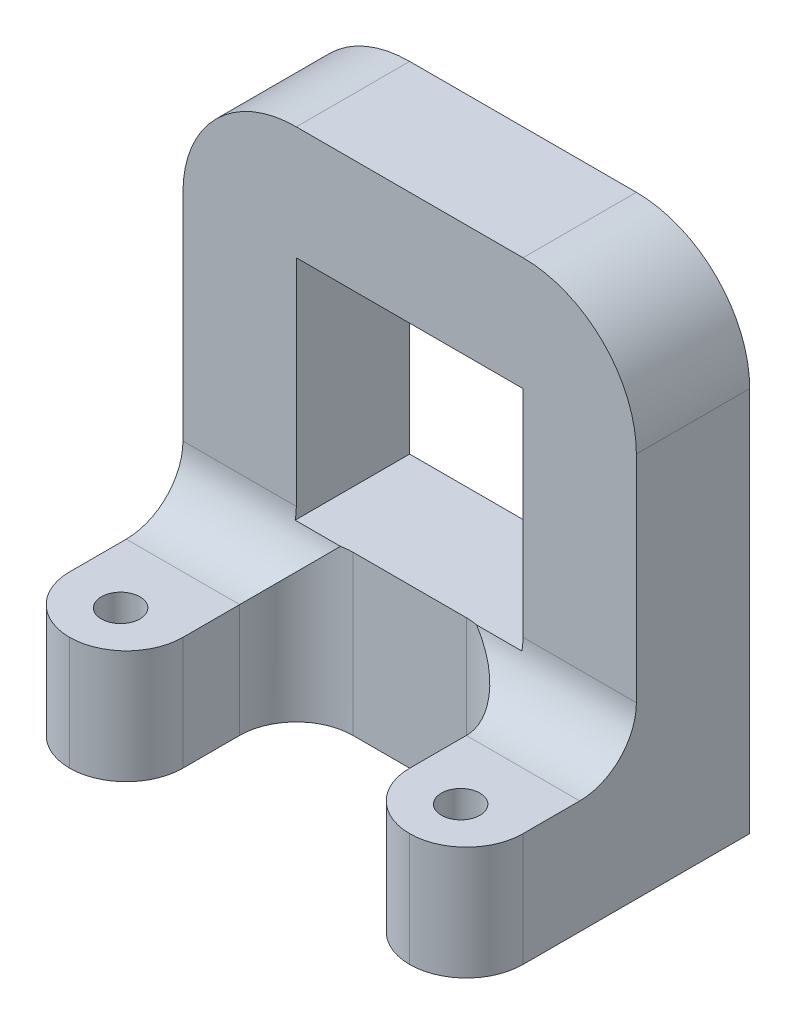
ISO-10303-21;
HEADER;
FILE_DESCRIPTION(('STEP AP214'),'2;1');
FILE_NAME('part.step','',(''),(''),'','','');
FILE_SCHEMA(('AUTOMOTIVE_DESIGN { 1 0 10303 214 1 1 1 1 }'));
ENDSEC;
DATA;
#1=APPLICATION_CONTEXT('core data for automotive mechanical design processes');
#2=APPLICATION_PROTOCOL_DEFINITION('international standard','automotive_design',2000,#1);
#3=PRODUCT_CONTEXT('',#1,'mechanical');
#4=PRODUCT('Part','Part','',(#3));
#5=PRODUCT_RELATED_PRODUCT_CATEGORY('part','',(#4));
#6=PRODUCT_DEFINITION_FORMATION('','',#4);
#7=PRODUCT_DEFINITION_CONTEXT('part definition',#1,'design');
#8=PRODUCT_DEFINITION('design','',#6,#7);
#9=PRODUCT_DEFINITION_SHAPE('','',#8);
#10=(LENGTH_UNIT() NAMED_UNIT(*) SI_UNIT(.MILLI.,.METRE.));
#11=(NAMED_UNIT(*) PLANE_ANGLE_UNIT() SI_UNIT($,.RADIAN.));
#12=(NAMED_UNIT(*) SI_UNIT($,.STERADIAN.) SOLID_ANGLE_UNIT());
#13=UNCERTAINTY_MEASURE_WITH_UNIT(LENGTH_MEASURE(1.E-05),#10,'distance_accuracy_value','');
#14=(GEOMETRIC_REPRESENTATION_CONTEXT(3) GLOBAL_UNCERTAINTY_ASSIGNED_CONTEXT((#13)) GLOBAL_UNIT_ASSIGNED_CONTEXT((#10,
#11,#12)) REPRESENTATION_CONTEXT('',''));
#15=CARTESIAN_POINT('',(0.,0.,0.));
#16=DIRECTION('',(0.,0.,1.));
#17=DIRECTION('',(1.,0.,0.));
#18=AXIS2_PLACEMENT_3D('',#15,#16,#17);
#19=CARTESIAN_POINT('',(0.,0.,10.));
#20=DIRECTION('',(0.,0.,1.));
#21=DIRECTION('',(1.,0.,0.));
#22=AXIS2_PLACEMENT_3D('',#19,#20,#21);
#23=PLANE('',#22);
#24=DIRECTION('',(0.,1.,0.));
#25=VECTOR('',#24,1.);
#26=CARTESIAN_POINT('',(30.,34.,10.));
#27=LINE('',#26,#25);
#28=CARTESIAN_POINT('',(30.,15.,10.));
#29=VERTEX_POINT('',#28);
#30=CARTESIAN_POINT('',(30.,34.,10.));
#31=VERTEX_POINT('',#30);
#32=EDGE_CURVE('E204',#29,#31,#27,.T.);
#33=ORIENTED_EDGE('',*,*,#32,.F.);
#34=DIRECTION('',(-1.,0.,0.));
#35=VECTOR('',#34,1.);
#36=CARTESIAN_POINT('',(0.,15.,10.));
#37=LINE('',#36,#35);
#38=CARTESIAN_POINT('',(40.,15.,10.));
#39=VERTEX_POINT('',#38);
#40=EDGE_CURVE('E295',#29,#39,#37,.F.);
#41=ORIENTED_EDGE('',*,*,#40,.T.);
#42=DIRECTION('',(0.,1.,0.));
#43=VECTOR('',#42,1.);
#44=CARTESIAN_POINT('',(40.,0.,10.));
#45=LINE('',#44,#43);
#46=CARTESIAN_POINT('',(40.,34.,10.));
#47=VERTEX_POINT('',#46);
#48=EDGE_CURVE('E245',#39,#47,#45,.T.);
#49=ORIENTED_EDGE('',*,*,#48,.T.);
#50=CARTESIAN_POINT('',(30.,34.,10.));
#51=DIRECTION('',(0.,0.,1.));
#52=DIRECTION('',(1.,0.,0.));
#53=AXIS2_PLACEMENT_3D('',#50,#51,#52);
#54=CIRCLE('',#53,10.);
#55=CARTESIAN_POINT('',(30.,44.,10.));
#56=VERTEX_POINT('',#55);
#57=EDGE_CURVE('E276',#47,#56,#54,.T.);
#58=ORIENTED_EDGE('',*,*,#57,.T.);
#59=DIRECTION('',(-1.,0.,0.));
#60=VECTOR('',#59,1.);
#61=CARTESIAN_POINT('',(40.,44.,10.));
#62=LINE('',#61,#60);
#63=CARTESIAN_POINT('',(10.,44.,10.));
#64=VERTEX_POINT('',#63);
#65=EDGE_CURVE('E247',#56,#64,#62,.T.);
#66=ORIENTED_EDGE('',*,*,#65,.T.);
#67=CARTESIAN_POINT('',(10.,34.,10.));
#68=DIRECTION('',(0.,0.,1.));
#69=DIRECTION('',(1.,0.,0.));
#70=AXIS2_PLACEMENT_3D('',#67,#68,#69);
#71=CIRCLE('',#70,10.);
#72=CARTESIAN_POINT('',(0.,34.,10.));
#73=VERTEX_POINT('',#72);
#74=EDGE_CURVE('E278',#64,#73,#71,.T.);
#75=ORIENTED_EDGE('',*,*,#74,.T.);
#76=DIRECTION('',(0.,-1.,0.));
#77=VECTOR('',#76,1.);
#78=CARTESIAN_POINT('',(0.,44.,10.));
#79=LINE('',#78,#77);
#80=CARTESIAN_POINT('',(0.,15.,10.));
#81=VERTEX_POINT('',#80);
#82=EDGE_CURVE('E239',#73,#81,#79,.T.);
#83=ORIENTED_EDGE('',*,*,#82,.T.);
#84=DIRECTION('',(-1.,0.,0.));
#85=VECTOR('',#84,1.);
#86=CARTESIAN_POINT('',(0.,15.,10.));
#87=LINE('',#86,#85);
#88=CARTESIAN_POINT('',(10.,15.,10.));
#89=VERTEX_POINT('',#88);
#90=EDGE_CURVE('E216',#81,#89,#87,.F.);
#91=ORIENTED_EDGE('',*,*,#90,.T.);
#92=DIRECTION('',(0.,-1.,0.));
#93=VECTOR('',#92,1.);
#94=CARTESIAN_POINT('',(10.,34.,10.));
#95=LINE('',#94,#93);
#96=CARTESIAN_POINT('',(10.,34.,10.));
#97=VERTEX_POINT('',#96);
#98=EDGE_CURVE('E209',#97,#89,#95,.T.);
#99=ORIENTED_EDGE('',*,*,#98,.F.);
#100=DIRECTION('',(-1.,0.,0.));
#101=VECTOR('',#100,1.);
#102=CARTESIAN_POINT('',(10.,34.,10.));
#103=LINE('',#102,#101);
#104=EDGE_CURVE('E194',#31,#97,#103,.T.);
#105=ORIENTED_EDGE('',*,*,#104,.F.);
#106=EDGE_LOOP('',(#33,#41,#49,#58,#66,#75,#83,#91,#99,#105));
#107=FACE_BOUND('',#106,.T.);
#108=ADVANCED_FACE('F37',(#107),#23,.T.);
#109=DIRECTION('',(1.,0.,0.));
#110=VECTOR('',#109,1.);
#111=CARTESIAN_POINT('',(0.,0.,10.));
#112=LINE('',#111,#110);
#113=CARTESIAN_POINT('',(15.,0.,10.));
#114=VERTEX_POINT('',#113);
#115=CARTESIAN_POINT('',(25.,0.,10.));
#116=VERTEX_POINT('',#115);
#117=EDGE_CURVE('E241',#114,#116,#112,.T.);
#118=ORIENTED_EDGE('',*,*,#117,.T.);
#119=DIRECTION('',(0.,-1.,0.));
#120=VECTOR('',#119,1.);
#121=CARTESIAN_POINT('',(25.,0.,10.));
#122=LINE('',#121,#120);
#123=CARTESIAN_POINT('',(25.,14.,10.));
#124=VERTEX_POINT('',#123);
#125=EDGE_CURVE('E292',#116,#124,#122,.F.);
#126=ORIENTED_EDGE('',*,*,#125,.T.);
#127=DIRECTION('',(1.,0.,0.));
#128=VECTOR('',#127,1.);
#129=CARTESIAN_POINT('',(10.,14.,10.));
#130=LINE('',#129,#128);
#131=CARTESIAN_POINT('',(15.,14.,10.));
#132=VERTEX_POINT('',#131);
#133=EDGE_CURVE('E217',#132,#124,#130,.T.);
#134=ORIENTED_EDGE('',*,*,#133,.F.);
#135=DIRECTION('',(0.,1.,0.));
#136=VECTOR('',#135,1.);
#137=CARTESIAN_POINT('',(15.,0.,10.));
#138=LINE('',#137,#136);
#139=EDGE_CURVE('E290',#132,#114,#138,.F.);
#140=ORIENTED_EDGE('',*,*,#139,.T.);
#141=EDGE_LOOP('',(#118,#126,#134,#140));
#142=FACE_BOUND('',#141,.T.);
#143=ADVANCED_FACE('F469',(#142),#23,.T.);
#144=CARTESIAN_POINT('',(0.,0.,0.));
#145=DIRECTION('',(0.,0.,1.));
#146=DIRECTION('',(1.,0.,0.));
#147=AXIS2_PLACEMENT_3D('',#144,#145,#146);
#148=PLANE('',#147);
#149=DIRECTION('',(0.,-1.,0.));
#150=VECTOR('',#149,1.);
#151=CARTESIAN_POINT('',(0.,44.,0.));
#152=LINE('',#151,#150);
#153=CARTESIAN_POINT('',(0.,34.,0.));
#154=VERTEX_POINT('',#153);
#155=CARTESIAN_POINT('',(0.,0.,0.));
#156=VERTEX_POINT('',#155);
#157=EDGE_CURVE('E238',#154,#156,#152,.T.);
#158=ORIENTED_EDGE('',*,*,#157,.F.);
#159=CARTESIAN_POINT('',(10.,34.,0.));
#160=DIRECTION('',(0.,0.,1.));
#161=DIRECTION('',(1.,0.,0.));
#162=AXIS2_PLACEMENT_3D('',#159,#160,#161);
#163=CIRCLE('',#162,10.);
#164=CARTESIAN_POINT('',(10.,44.,0.));
#165=VERTEX_POINT('',#164);
#166=EDGE_CURVE('E269',#154,#165,#163,.F.);
#167=ORIENTED_EDGE('',*,*,#166,.T.);
#168=DIRECTION('',(-1.,0.,0.));
#169=VECTOR('',#168,1.);
#170=CARTESIAN_POINT('',(40.,44.,0.));
#171=LINE('',#170,#169);
#172=CARTESIAN_POINT('',(30.,44.,0.));
#173=VERTEX_POINT('',#172);
#174=EDGE_CURVE('E242',#173,#165,#171,.T.);
#175=ORIENTED_EDGE('',*,*,#174,.F.);
#176=CARTESIAN_POINT('',(30.,34.,0.));
#177=DIRECTION('',(0.,0.,1.));
#178=DIRECTION('',(1.,0.,0.));
#179=AXIS2_PLACEMENT_3D('',#176,#177,#178);
#180=CIRCLE('',#179,10.);
#181=CARTESIAN_POINT('',(40.,34.,0.));
#182=VERTEX_POINT('',#181);
#183=EDGE_CURVE('E267',#173,#182,#180,.F.);
#184=ORIENTED_EDGE('',*,*,#183,.T.);
#185=DIRECTION('',(0.,1.,0.));
#186=VECTOR('',#185,1.);
#187=CARTESIAN_POINT('',(40.,0.,0.));
#188=LINE('',#187,#186);
#189=CARTESIAN_POINT('',(40.,0.,0.));
#190=VERTEX_POINT('',#189);
#191=EDGE_CURVE('E256',#190,#182,#188,.T.);
#192=ORIENTED_EDGE('',*,*,#191,.F.);
#193=DIRECTION('',(1.,0.,0.));
#194=VECTOR('',#193,1.);
#195=CARTESIAN_POINT('',(0.,0.,0.));
#196=LINE('',#195,#194);
#197=EDGE_CURVE('E253',#156,#190,#196,.T.);
#198=ORIENTED_EDGE('',*,*,#197,.F.);
#199=EDGE_LOOP('',(#158,#167,#175,#184,#192,#198));
#200=FACE_BOUND('',#199,.T.);
#201=DIRECTION('',(0.,-1.,0.));
#202=VECTOR('',#201,1.);
#203=CARTESIAN_POINT('',(10.,34.,0.));
#204=LINE('',#203,#202);
#205=CARTESIAN_POINT('',(10.,34.,0.));
#206=VERTEX_POINT('',#205);
#207=CARTESIAN_POINT('',(10.,14.,0.));
#208=VERTEX_POINT('',#207);
#209=EDGE_CURVE('E212',#206,#208,#204,.T.);
#210=ORIENTED_EDGE('',*,*,#209,.T.);
#211=DIRECTION('',(1.,0.,0.));
#212=VECTOR('',#211,1.);
#213=CARTESIAN_POINT('',(10.,14.,0.));
#214=LINE('',#213,#212);
#215=CARTESIAN_POINT('',(30.,14.,0.));
#216=VERTEX_POINT('',#215);
#217=EDGE_CURVE('E230',#208,#216,#214,.T.);
#218=ORIENTED_EDGE('',*,*,#217,.T.);
#219=DIRECTION('',(0.,1.,0.));
#220=VECTOR('',#219,1.);
#221=CARTESIAN_POINT('',(30.,34.,0.));
#222=LINE('',#221,#220);
#223=CARTESIAN_POINT('',(30.,34.,0.));
#224=VERTEX_POINT('',#223);
#225=EDGE_CURVE('E222',#216,#224,#222,.T.);
#226=ORIENTED_EDGE('',*,*,#225,.T.);
#227=DIRECTION('',(-1.,0.,0.));
#228=VECTOR('',#227,1.);
#229=CARTESIAN_POINT('',(10.,34.,0.));
#230=LINE('',#229,#228);
#231=EDGE_CURVE('E218',#224,#206,#230,.T.);
#232=ORIENTED_EDGE('',*,*,#231,.T.);
#233=EDGE_LOOP('',(#210,#218,#226,#232));
#234=FACE_BOUND('',#233,.T.);
#235=ADVANCED_FACE('F378',(#200,#234),#148,.F.);
#236=CARTESIAN_POINT('',(0.,44.,10.));
#237=DIRECTION('',(1.,0.,0.));
#238=DIRECTION('',(0.,1.,0.));
#239=AXIS2_PLACEMENT_3D('',#236,#237,#238);
#240=PLANE('',#239);
#241=DIRECTION('',(0.,0.,-1.));
#242=VECTOR('',#241,1.);
#243=CARTESIAN_POINT('',(0.,0.,10.));
#244=LINE('',#243,#242);
#245=CARTESIAN_POINT('',(0.,0.,20.));
#246=VERTEX_POINT('',#245);
#247=EDGE_CURVE('E262',#246,#156,#244,.T.);
#248=ORIENTED_EDGE('',*,*,#247,.F.);
#249=DIRECTION('',(0.,-1.,0.));
#250=VECTOR('',#249,1.);
#251=CARTESIAN_POINT('',(0.,10.,20.));
#252=LINE('',#251,#250);
#253=CARTESIAN_POINT('',(0.,10.,20.));
#254=VERTEX_POINT('',#253);
#255=EDGE_CURVE('E324',#246,#254,#252,.F.);
#256=ORIENTED_EDGE('',*,*,#255,.T.);
#257=DIRECTION('',(0.,0.,-1.));
#258=VECTOR('',#257,1.);
#259=CARTESIAN_POINT('',(0.,10.,25.));
#260=LINE('',#259,#258);
#261=CARTESIAN_POINT('',(0.,10.,15.));
#262=VERTEX_POINT('',#261);
#263=EDGE_CURVE('E415',#254,#262,#260,.T.);
#264=ORIENTED_EDGE('',*,*,#263,.T.);
#265=CARTESIAN_POINT('',(0.,15.,15.));
#266=DIRECTION('',(1.,0.,0.));
#267=DIRECTION('',(0.,1.,0.));
#268=AXIS2_PLACEMENT_3D('',#265,#266,#267);
#269=CIRCLE('',#268,5.);
#270=EDGE_CURVE('E332',#262,#81,#269,.T.);
#271=ORIENTED_EDGE('',*,*,#270,.T.);
#272=ORIENTED_EDGE('',*,*,#82,.F.);
#273=DIRECTION('',(0.,0.,-1.));
#274=VECTOR('',#273,1.);
#275=CARTESIAN_POINT('',(0.,34.,10.));
#276=LINE('',#275,#274);
#277=EDGE_CURVE('E264',#73,#154,#276,.T.);
#278=ORIENTED_EDGE('',*,*,#277,.T.);
#279=ORIENTED_EDGE('',*,*,#157,.T.);
#280=EDGE_LOOP('',(#248,#256,#264,#271,#272,#278,#279));
#281=FACE_BOUND('',#280,.T.);
#282=ADVANCED_FACE('F369',(#281),#240,.F.);
#283=CARTESIAN_POINT('',(0.,0.,10.));
#284=DIRECTION('',(0.,1.,0.));
#285=DIRECTION('',(0.,0.,1.));
#286=AXIS2_PLACEMENT_3D('',#283,#284,#285);
#287=PLANE('',#286);
#288=CARTESIAN_POINT('',(5.,0.,20.5));
#289=DIRECTION('',(0.,1.,0.));
#290=DIRECTION('',(0.,0.,1.));
#291=AXIS2_PLACEMENT_3D('',#288,#289,#290);
#292=CIRCLE('',#291,1.7);
#293=CARTESIAN_POINT('',(5.,0.,22.2));
#294=VERTEX_POINT('',#293);
#295=EDGE_CURVE('E701',#294,#294,#292,.T.);
#296=ORIENTED_EDGE('',*,*,#295,.T.);
#297=EDGE_LOOP('',(#296));
#298=FACE_BOUND('',#297,.T.);
#299=CARTESIAN_POINT('',(35.,0.,20.5));
#300=DIRECTION('',(0.,1.,0.));
#301=DIRECTION('',(0.,0.,1.));
#302=AXIS2_PLACEMENT_3D('',#299,#300,#301);
#303=CIRCLE('',#302,1.7);
#304=CARTESIAN_POINT('',(35.,0.,22.2));
#305=VERTEX_POINT('',#304);
#306=EDGE_CURVE('E406',#305,#305,#303,.T.);
#307=ORIENTED_EDGE('',*,*,#306,.T.);
#308=EDGE_LOOP('',(#307));
#309=FACE_BOUND('',#308,.T.);
#310=DIRECTION('',(0.,0.,-1.));
#311=VECTOR('',#310,1.);
#312=CARTESIAN_POINT('',(40.,0.,10.));
#313=LINE('',#312,#311);
#314=CARTESIAN_POINT('',(40.,0.,20.));
#315=VERTEX_POINT('',#314);
#316=EDGE_CURVE('E250',#315,#190,#313,.T.);
#317=ORIENTED_EDGE('',*,*,#316,.F.);
#318=CARTESIAN_POINT('',(35.,0.,20.));
#319=DIRECTION('',(0.,1.,0.));
#320=DIRECTION('',(0.,0.,1.));
#321=AXIS2_PLACEMENT_3D('',#318,#319,#320);
#322=CIRCLE('',#321,5.);
#323=CARTESIAN_POINT('',(35.,0.,25.));
#324=VERTEX_POINT('',#323);
#325=EDGE_CURVE('E322',#315,#324,#322,.F.);
#326=ORIENTED_EDGE('',*,*,#325,.T.);
#327=CARTESIAN_POINT('',(35.,0.,20.));
#328=DIRECTION('',(0.,1.,0.));
#329=DIRECTION('',(0.,0.,1.));
#330=AXIS2_PLACEMENT_3D('',#327,#328,#329);
#331=CIRCLE('',#330,5.);
#332=CARTESIAN_POINT('',(30.,0.,20.));
#333=VERTEX_POINT('',#332);
#334=EDGE_CURVE('E320',#324,#333,#331,.F.);
#335=ORIENTED_EDGE('',*,*,#334,.T.);
#336=DIRECTION('',(0.,0.,-1.));
#337=VECTOR('',#336,1.);
#338=CARTESIAN_POINT('',(30.,0.,25.));
#339=LINE('',#338,#337);
#340=CARTESIAN_POINT('',(30.,0.,15.));
#341=VERTEX_POINT('',#340);
#342=EDGE_CURVE('E401',#333,#341,#339,.T.);
#343=ORIENTED_EDGE('',*,*,#342,.T.);
#344=CARTESIAN_POINT('',(25.,0.,15.));
#345=DIRECTION('',(0.,1.,0.));
#346=DIRECTION('',(0.,0.,1.));
#347=AXIS2_PLACEMENT_3D('',#344,#345,#346);
#348=CIRCLE('',#347,5.);
#349=EDGE_CURVE('E338',#341,#116,#348,.T.);
#350=ORIENTED_EDGE('',*,*,#349,.T.);
#351=ORIENTED_EDGE('',*,*,#117,.F.);
#352=CARTESIAN_POINT('',(15.,0.,15.));
#353=DIRECTION('',(0.,1.,0.));
#354=DIRECTION('',(0.,0.,1.));
#355=AXIS2_PLACEMENT_3D('',#352,#353,#354);
#356=CIRCLE('',#355,5.);
#357=CARTESIAN_POINT('',(10.,0.,15.));
#358=VERTEX_POINT('',#357);
#359=EDGE_CURVE('E11',#114,#358,#356,.T.);
#360=ORIENTED_EDGE('',*,*,#359,.T.);
#361=DIRECTION('',(0.,0.,-1.));
#362=VECTOR('',#361,1.);
#363=CARTESIAN_POINT('',(10.,0.,25.));
#364=LINE('',#363,#362);
#365=CARTESIAN_POINT('',(10.,0.,20.));
#366=VERTEX_POINT('',#365);
#367=EDGE_CURVE('E225',#366,#358,#364,.T.);
#368=ORIENTED_EDGE('',*,*,#367,.F.);
#369=CARTESIAN_POINT('',(5.,0.,20.));
#370=DIRECTION('',(0.,1.,0.));
#371=DIRECTION('',(0.,0.,1.));
#372=AXIS2_PLACEMENT_3D('',#369,#370,#371);
#373=CIRCLE('',#372,5.);
#374=CARTESIAN_POINT('',(5.,0.,25.));
#375=VERTEX_POINT('',#374);
#376=EDGE_CURVE('E318',#366,#375,#373,.F.);
#377=ORIENTED_EDGE('',*,*,#376,.T.);
#378=CARTESIAN_POINT('',(5.,0.,20.));
#379=DIRECTION('',(0.,1.,0.));
#380=DIRECTION('',(0.,0.,1.));
#381=AXIS2_PLACEMENT_3D('',#378,#379,#380);
#382=CIRCLE('',#381,5.);
#383=EDGE_CURVE('E316',#375,#246,#382,.F.);
#384=ORIENTED_EDGE('',*,*,#383,.T.);
#385=ORIENTED_EDGE('',*,*,#247,.T.);
#386=ORIENTED_EDGE('',*,*,#197,.T.);
#387=EDGE_LOOP('',(#317,#326,#335,#343,#350,#351,#360,#368,#377,#384,#385,#386));
#388=FACE_BOUND('',#387,.T.);
#389=ADVANCED_FACE('F366',(#298,#309,#388),#287,.F.);
#390=CARTESIAN_POINT('',(40.,0.,10.));
#391=DIRECTION('',(-1.,0.,0.));
#392=DIRECTION('',(0.,0.,1.));
#393=AXIS2_PLACEMENT_3D('',#390,#391,#392);
#394=PLANE('',#393);
#395=DIRECTION('',(0.,0.,-1.));
#396=VECTOR('',#395,1.);
#397=CARTESIAN_POINT('',(40.,10.,25.));
#398=LINE('',#397,#396);
#399=CARTESIAN_POINT('',(40.,10.,20.));
#400=VERTEX_POINT('',#399);
#401=CARTESIAN_POINT('',(40.,10.,15.));
#402=VERTEX_POINT('',#401);
#403=EDGE_CURVE('E387',#400,#402,#398,.T.);
#404=ORIENTED_EDGE('',*,*,#403,.F.);
#405=DIRECTION('',(0.,1.,0.));
#406=VECTOR('',#405,1.);
#407=CARTESIAN_POINT('',(40.,0.,20.));
#408=LINE('',#407,#406);
#409=EDGE_CURVE('E313',#400,#315,#408,.F.);
#410=ORIENTED_EDGE('',*,*,#409,.T.);
#411=ORIENTED_EDGE('',*,*,#316,.T.);
#412=ORIENTED_EDGE('',*,*,#191,.T.);
#413=DIRECTION('',(0.,0.,-1.));
#414=VECTOR('',#413,1.);
#415=CARTESIAN_POINT('',(40.,34.,10.));
#416=LINE('',#415,#414);
#417=EDGE_CURVE('E280',#182,#47,#416,.F.);
#418=ORIENTED_EDGE('',*,*,#417,.T.);
#419=ORIENTED_EDGE('',*,*,#48,.F.);
#420=CARTESIAN_POINT('',(40.,15.,15.));
#421=DIRECTION('',(-1.,0.,0.));
#422=DIRECTION('',(0.,0.,1.));
#423=AXIS2_PLACEMENT_3D('',#420,#421,#422);
#424=CIRCLE('',#423,5.);
#425=EDGE_CURVE('E330',#39,#402,#424,.T.);
#426=ORIENTED_EDGE('',*,*,#425,.T.);
#427=EDGE_LOOP('',(#404,#410,#411,#412,#418,#419,#426));
#428=FACE_BOUND('',#427,.T.);
#429=ADVANCED_FACE('F383',(#428),#394,.F.);
#430=CARTESIAN_POINT('',(40.,44.,10.));
#431=DIRECTION('',(0.,-1.,0.));
#432=DIRECTION('',(0.,0.,-1.));
#433=AXIS2_PLACEMENT_3D('',#430,#431,#432);
#434=PLANE('',#433);
#435=ORIENTED_EDGE('',*,*,#174,.T.);
#436=DIRECTION('',(0.,0.,-1.));
#437=VECTOR('',#436,1.);
#438=CARTESIAN_POINT('',(10.,44.,10.));
#439=LINE('',#438,#437);
#440=EDGE_CURVE('E274',#165,#64,#439,.F.);
#441=ORIENTED_EDGE('',*,*,#440,.T.);
#442=ORIENTED_EDGE('',*,*,#65,.F.);
#443=DIRECTION('',(0.,0.,-1.));
#444=VECTOR('',#443,1.);
#445=CARTESIAN_POINT('',(30.,44.,10.));
#446=LINE('',#445,#444);
#447=EDGE_CURVE('E271',#56,#173,#446,.T.);
#448=ORIENTED_EDGE('',*,*,#447,.T.);
#449=EDGE_LOOP('',(#435,#441,#442,#448));
#450=FACE_BOUND('',#449,.T.);
#451=ADVANCED_FACE('F449',(#450),#434,.F.);
#452=CARTESIAN_POINT('',(10.,34.,10.));
#453=DIRECTION('',(1.,0.,0.));
#454=DIRECTION('',(0.,1.,0.));
#455=AXIS2_PLACEMENT_3D('',#452,#453,#454);
#456=PLANE('',#455);
#457=ORIENTED_EDGE('',*,*,#209,.F.);
#458=DIRECTION('',(0.,0.,-1.));
#459=VECTOR('',#458,1.);
#460=CARTESIAN_POINT('',(10.,34.,10.));
#461=LINE('',#460,#459);
#462=EDGE_CURVE('E198',#97,#206,#461,.T.);
#463=ORIENTED_EDGE('',*,*,#462,.F.);
#464=ORIENTED_EDGE('',*,*,#98,.T.);
#465=CARTESIAN_POINT('',(10.,15.,15.));
#466=DIRECTION('',(1.,0.,0.));
#467=DIRECTION('',(0.,1.,0.));
#468=AXIS2_PLACEMENT_3D('',#465,#466,#467);
#469=CIRCLE('',#468,5.);
#470=CARTESIAN_POINT('',(10.,14.,10.1010205144336));
#471=VERTEX_POINT('',#470);
#472=EDGE_CURVE('E334',#89,#471,#469,.F.);
#473=ORIENTED_EDGE('',*,*,#472,.T.);
#474=DIRECTION('',(0.,0.,-1.));
#475=VECTOR('',#474,1.);
#476=CARTESIAN_POINT('',(10.,14.,10.));
#477=LINE('',#476,#475);
#478=EDGE_CURVE('E54',#471,#208,#477,.T.);
#479=ORIENTED_EDGE('',*,*,#478,.T.);
#480=EDGE_LOOP('',(#457,#463,#464,#473,#479));
#481=FACE_BOUND('',#480,.T.);
#482=ADVANCED_FACE('F208',(#481),#456,.T.);
#483=CARTESIAN_POINT('',(10.,14.,10.));
#484=DIRECTION('',(0.,1.,0.));
#485=DIRECTION('',(0.,0.,1.));
#486=AXIS2_PLACEMENT_3D('',#483,#484,#485);
#487=PLANE('',#486);
#488=ORIENTED_EDGE('',*,*,#217,.F.);
#489=ORIENTED_EDGE('',*,*,#478,.F.);
#490=DIRECTION('',(-1.,0.,0.));
#491=VECTOR('',#490,1.);
#492=CARTESIAN_POINT('',(10.,14.,10.1010205144336));
#493=LINE('',#492,#491);
#494=CARTESIAN_POINT('',(14.,14.,10.1010205144336));
#495=VERTEX_POINT('',#494);
#496=EDGE_CURVE('E336',#471,#495,#493,.F.);
#497=ORIENTED_EDGE('',*,*,#496,.T.);
#498=CARTESIAN_POINT('',(15.,14.,15.));
#499=DIRECTION('',(0.,1.,0.));
#500=DIRECTION('',(0.,0.,1.));
#501=AXIS2_PLACEMENT_3D('',#498,#499,#500);
#502=CIRCLE('',#501,5.);
#503=EDGE_CURVE('E46',#495,#132,#502,.F.);
#504=ORIENTED_EDGE('',*,*,#503,.T.);
#505=ORIENTED_EDGE('',*,*,#133,.T.);
#506=CARTESIAN_POINT('',(25.,14.,15.));
#507=DIRECTION('',(0.,1.,0.));
#508=DIRECTION('',(0.,0.,1.));
#509=AXIS2_PLACEMENT_3D('',#506,#507,#508);
#510=CIRCLE('',#509,5.);
#511=CARTESIAN_POINT('',(26.,14.,10.1010205144336));
#512=VERTEX_POINT('',#511);
#513=EDGE_CURVE('E340',#124,#512,#510,.F.);
#514=ORIENTED_EDGE('',*,*,#513,.T.);
#515=DIRECTION('',(-1.,0.,0.));
#516=VECTOR('',#515,1.);
#517=CARTESIAN_POINT('',(26.,14.,10.1010205144336));
#518=LINE('',#517,#516);
#519=CARTESIAN_POINT('',(30.,14.,10.1010205144336));
#520=VERTEX_POINT('',#519);
#521=EDGE_CURVE('E326',#512,#520,#518,.F.);
#522=ORIENTED_EDGE('',*,*,#521,.T.);
#523=DIRECTION('',(0.,0.,-1.));
#524=VECTOR('',#523,1.);
#525=CARTESIAN_POINT('',(30.,14.,10.));
#526=LINE('',#525,#524);
#527=EDGE_CURVE('E62',#520,#216,#526,.T.);
#528=ORIENTED_EDGE('',*,*,#527,.T.);
#529=EDGE_LOOP('',(#488,#489,#497,#504,#505,#514,#522,#528));
#530=FACE_BOUND('',#529,.T.);
#531=ADVANCED_FACE('F510',(#530),#487,.T.);
#532=CARTESIAN_POINT('',(30.,34.,10.));
#533=DIRECTION('',(-1.,0.,0.));
#534=DIRECTION('',(0.,-1.,0.));
#535=AXIS2_PLACEMENT_3D('',#532,#533,#534);
#536=PLANE('',#535);
#537=ORIENTED_EDGE('',*,*,#225,.F.);
#538=ORIENTED_EDGE('',*,*,#527,.F.);
#539=CARTESIAN_POINT('',(30.,15.,15.));
#540=DIRECTION('',(-1.,0.,0.));
#541=DIRECTION('',(0.,-1.,0.));
#542=AXIS2_PLACEMENT_3D('',#539,#540,#541);
#543=CIRCLE('',#542,5.);
#544=EDGE_CURVE('E328',#520,#29,#543,.F.);
#545=ORIENTED_EDGE('',*,*,#544,.T.);
#546=ORIENTED_EDGE('',*,*,#32,.T.);
#547=DIRECTION('',(0.,0.,-1.));
#548=VECTOR('',#547,1.);
#549=CARTESIAN_POINT('',(30.,34.,10.));
#550=LINE('',#549,#548);
#551=EDGE_CURVE('E200',#31,#224,#550,.T.);
#552=ORIENTED_EDGE('',*,*,#551,.T.);
#553=EDGE_LOOP('',(#537,#538,#545,#546,#552));
#554=FACE_BOUND('',#553,.T.);
#555=ADVANCED_FACE('F436',(#554),#536,.T.);
#556=CARTESIAN_POINT('',(10.,34.,10.));
#557=DIRECTION('',(0.,-1.,0.));
#558=DIRECTION('',(0.,0.,-1.));
#559=AXIS2_PLACEMENT_3D('',#556,#557,#558);
#560=PLANE('',#559);
#561=ORIENTED_EDGE('',*,*,#231,.F.);
#562=ORIENTED_EDGE('',*,*,#551,.F.);
#563=ORIENTED_EDGE('',*,*,#104,.T.);
#564=ORIENTED_EDGE('',*,*,#462,.T.);
#565=EDGE_LOOP('',(#561,#562,#563,#564));
#566=FACE_BOUND('',#565,.T.);
#567=ADVANCED_FACE('F197',(#566),#560,.T.);
#568=CARTESIAN_POINT('',(10.,0.,25.));
#569=DIRECTION('',(-1.,0.,0.));
#570=DIRECTION('',(0.,0.,1.));
#571=AXIS2_PLACEMENT_3D('',#568,#569,#570);
#572=PLANE('',#571);
#573=ORIENTED_EDGE('',*,*,#367,.T.);
#574=DIRECTION('',(0.,1.,0.));
#575=VECTOR('',#574,1.);
#576=CARTESIAN_POINT('',(10.,0.,15.));
#577=LINE('',#576,#575);
#578=CARTESIAN_POINT('',(10.,10.,15.));
#579=VERTEX_POINT('',#578);
#580=EDGE_CURVE('E311',#358,#579,#577,.T.);
#581=ORIENTED_EDGE('',*,*,#580,.T.);
#582=DIRECTION('',(0.,0.,-1.));
#583=VECTOR('',#582,1.);
#584=CARTESIAN_POINT('',(10.,10.,25.));
#585=LINE('',#584,#583);
#586=CARTESIAN_POINT('',(10.,10.,20.));
#587=VERTEX_POINT('',#586);
#588=EDGE_CURVE('E416',#587,#579,#585,.T.);
#589=ORIENTED_EDGE('',*,*,#588,.F.);
#590=DIRECTION('',(0.,1.,0.));
#591=VECTOR('',#590,1.);
#592=CARTESIAN_POINT('',(10.,0.,20.));
#593=LINE('',#592,#591);
#594=EDGE_CURVE('E308',#587,#366,#593,.F.);
#595=ORIENTED_EDGE('',*,*,#594,.T.);
#596=EDGE_LOOP('',(#573,#581,#589,#595));
#597=FACE_BOUND('',#596,.T.);
#598=ADVANCED_FACE('F424',(#597),#572,.F.);
#599=CARTESIAN_POINT('',(0.,10.,25.));
#600=DIRECTION('',(0.,-1.,0.));
#601=DIRECTION('',(1.,0.,0.));
#602=AXIS2_PLACEMENT_3D('',#599,#600,#601);
#603=PLANE('',#602);
#604=CARTESIAN_POINT('',(5.,10.,20.5));
#605=DIRECTION('',(0.,1.,0.));
#606=DIRECTION('',(0.,0.,1.));
#607=AXIS2_PLACEMENT_3D('',#604,#605,#606);
#608=CIRCLE('',#607,1.69999999999999);
#609=CARTESIAN_POINT('',(5.,10.,22.2));
#610=VERTEX_POINT('',#609);
#611=EDGE_CURVE('E345',#610,#610,#608,.T.);
#612=ORIENTED_EDGE('',*,*,#611,.F.);
#613=EDGE_LOOP('',(#612));
#614=FACE_BOUND('',#613,.T.);
#615=ORIENTED_EDGE('',*,*,#588,.T.);
#616=DIRECTION('',(-1.,0.,0.));
#617=VECTOR('',#616,1.);
#618=CARTESIAN_POINT('',(0.,10.,15.));
#619=LINE('',#618,#617);
#620=EDGE_CURVE('E301',#579,#262,#619,.T.);
#621=ORIENTED_EDGE('',*,*,#620,.T.);
#622=ORIENTED_EDGE('',*,*,#263,.F.);
#623=CARTESIAN_POINT('',(5.,10.,20.));
#624=DIRECTION('',(0.,-1.,0.));
#625=DIRECTION('',(1.,0.,0.));
#626=AXIS2_PLACEMENT_3D('',#623,#624,#625);
#627=CIRCLE('',#626,5.);
#628=CARTESIAN_POINT('',(5.,10.,25.));
#629=VERTEX_POINT('',#628);
#630=EDGE_CURVE('E297',#254,#629,#627,.F.);
#631=ORIENTED_EDGE('',*,*,#630,.T.);
#632=CARTESIAN_POINT('',(5.,10.,20.));
#633=DIRECTION('',(0.,-1.,0.));
#634=DIRECTION('',(1.,0.,0.));
#635=AXIS2_PLACEMENT_3D('',#632,#633,#634);
#636=CIRCLE('',#635,5.);
#637=EDGE_CURVE('E299',#629,#587,#636,.F.);
#638=ORIENTED_EDGE('',*,*,#637,.T.);
#639=EDGE_LOOP('',(#615,#621,#622,#631,#638));
#640=FACE_BOUND('',#639,.T.);
#641=ADVANCED_FACE('F434',(#614,#640),#603,.F.);
#642=CARTESIAN_POINT('',(40.,10.,25.));
#643=DIRECTION('',(0.,-1.,0.));
#644=DIRECTION('',(1.,0.,0.));
#645=AXIS2_PLACEMENT_3D('',#642,#643,#644);
#646=PLANE('',#645);
#647=CARTESIAN_POINT('',(35.,10.,20.5));
#648=DIRECTION('',(0.,1.,0.));
#649=DIRECTION('',(0.,0.,1.));
#650=AXIS2_PLACEMENT_3D('',#647,#648,#649);
#651=CIRCLE('',#650,1.69999999999999);
#652=CARTESIAN_POINT('',(35.,10.,22.2));
#653=VERTEX_POINT('',#652);
#654=EDGE_CURVE('E410',#653,#653,#651,.T.);
#655=ORIENTED_EDGE('',*,*,#654,.F.);
#656=EDGE_LOOP('',(#655));
#657=FACE_BOUND('',#656,.T.);
#658=ORIENTED_EDGE('',*,*,#403,.T.);
#659=DIRECTION('',(-1.,0.,0.));
#660=VECTOR('',#659,1.);
#661=CARTESIAN_POINT('',(40.,10.,15.));
#662=LINE('',#661,#660);
#663=CARTESIAN_POINT('',(30.,10.,15.));
#664=VERTEX_POINT('',#663);
#665=EDGE_CURVE('E287',#402,#664,#662,.T.);
#666=ORIENTED_EDGE('',*,*,#665,.T.);
#667=DIRECTION('',(0.,0.,-1.));
#668=VECTOR('',#667,1.);
#669=CARTESIAN_POINT('',(30.,10.,25.));
#670=LINE('',#669,#668);
#671=CARTESIAN_POINT('',(30.,10.,20.));
#672=VERTEX_POINT('',#671);
#673=EDGE_CURVE('E395',#672,#664,#670,.T.);
#674=ORIENTED_EDGE('',*,*,#673,.F.);
#675=CARTESIAN_POINT('',(35.,10.,20.));
#676=DIRECTION('',(0.,-1.,0.));
#677=DIRECTION('',(1.,0.,0.));
#678=AXIS2_PLACEMENT_3D('',#675,#676,#677);
#679=CIRCLE('',#678,5.);
#680=CARTESIAN_POINT('',(35.,10.,25.));
#681=VERTEX_POINT('',#680);
#682=EDGE_CURVE('E283',#672,#681,#679,.F.);
#683=ORIENTED_EDGE('',*,*,#682,.T.);
#684=CARTESIAN_POINT('',(35.,10.,20.));
#685=DIRECTION('',(0.,-1.,0.));
#686=DIRECTION('',(1.,0.,0.));
#687=AXIS2_PLACEMENT_3D('',#684,#685,#686);
#688=CIRCLE('',#687,5.);
#689=EDGE_CURVE('E285',#681,#400,#688,.F.);
#690=ORIENTED_EDGE('',*,*,#689,.T.);
#691=EDGE_LOOP('',(#658,#666,#674,#683,#690));
#692=FACE_BOUND('',#691,.T.);
#693=ADVANCED_FACE('F390',(#657,#692),#646,.F.);
#694=CARTESIAN_POINT('',(30.,0.,25.));
#695=DIRECTION('',(1.,0.,0.));
#696=DIRECTION('',(0.,0.,-1.));
#697=AXIS2_PLACEMENT_3D('',#694,#695,#696);
#698=PLANE('',#697);
#699=ORIENTED_EDGE('',*,*,#673,.T.);
#700=DIRECTION('',(0.,-1.,0.));
#701=VECTOR('',#700,1.);
#702=CARTESIAN_POINT('',(30.,0.,15.));
#703=LINE('',#702,#701);
#704=EDGE_CURVE('E306',#664,#341,#703,.T.);
#705=ORIENTED_EDGE('',*,*,#704,.T.);
#706=ORIENTED_EDGE('',*,*,#342,.F.);
#707=DIRECTION('',(0.,-1.,0.));
#708=VECTOR('',#707,1.);
#709=CARTESIAN_POINT('',(30.,10.,20.));
#710=LINE('',#709,#708);
#711=EDGE_CURVE('E304',#333,#672,#710,.F.);
#712=ORIENTED_EDGE('',*,*,#711,.T.);
#713=EDGE_LOOP('',(#699,#705,#706,#712));
#714=FACE_BOUND('',#713,.T.);
#715=ADVANCED_FACE('F404',(#714),#698,.F.);
#716=CARTESIAN_POINT('',(35.,10.,20.5));
#717=DIRECTION('',(0.,1.,0.));
#718=DIRECTION('',(0.,0.,1.));
#719=AXIS2_PLACEMENT_3D('',#716,#717,#718);
#720=CYLINDRICAL_SURFACE('',#719,1.69999999999999);
#721=ORIENTED_EDGE('',*,*,#306,.F.);
#722=EDGE_LOOP('',(#721));
#723=FACE_BOUND('',#722,.T.);
#724=ORIENTED_EDGE('',*,*,#654,.T.);
#725=EDGE_LOOP('',(#724));
#726=FACE_BOUND('',#725,.T.);
#727=ADVANCED_FACE('F464',(#723,#726),#720,.F.);
#728=CARTESIAN_POINT('',(5.,10.,20.5));
#729=DIRECTION('',(0.,1.,0.));
#730=DIRECTION('',(0.,0.,1.));
#731=AXIS2_PLACEMENT_3D('',#728,#729,#730);
#732=CYLINDRICAL_SURFACE('',#731,1.69999999999999);
#733=ORIENTED_EDGE('',*,*,#295,.F.);
#734=EDGE_LOOP('',(#733));
#735=FACE_BOUND('',#734,.T.);
#736=ORIENTED_EDGE('',*,*,#611,.T.);
#737=EDGE_LOOP('',(#736));
#738=FACE_BOUND('',#737,.T.);
#739=ADVANCED_FACE('F456',(#735,#738),#732,.F.);
#740=CARTESIAN_POINT('',(10.,34.,10.));
#741=DIRECTION('',(0.,0.,-1.));
#742=DIRECTION('',(-1.,0.,0.));
#743=AXIS2_PLACEMENT_3D('',#740,#741,#742);
#744=CYLINDRICAL_SURFACE('',#743,10.);
#745=ORIENTED_EDGE('',*,*,#74,.F.);
#746=ORIENTED_EDGE('',*,*,#440,.F.);
#747=ORIENTED_EDGE('',*,*,#166,.F.);
#748=ORIENTED_EDGE('',*,*,#277,.F.);
#749=EDGE_LOOP('',(#745,#746,#747,#748));
#750=FACE_BOUND('',#749,.T.);
#751=ADVANCED_FACE('F454',(#750),#744,.T.);
#752=CARTESIAN_POINT('',(30.,34.,10.));
#753=DIRECTION('',(0.,0.,-1.));
#754=DIRECTION('',(-1.,0.,0.));
#755=AXIS2_PLACEMENT_3D('',#752,#753,#754);
#756=CYLINDRICAL_SURFACE('',#755,10.);
#757=ORIENTED_EDGE('',*,*,#57,.F.);
#758=ORIENTED_EDGE('',*,*,#417,.F.);
#759=ORIENTED_EDGE('',*,*,#183,.F.);
#760=ORIENTED_EDGE('',*,*,#447,.F.);
#761=EDGE_LOOP('',(#757,#758,#759,#760));
#762=FACE_BOUND('',#761,.T.);
#763=ADVANCED_FACE('F452',(#762),#756,.T.);
#764=CARTESIAN_POINT('',(25.,0.,15.));
#765=DIRECTION('',(0.,-1.,0.));
#766=DIRECTION('',(0.,0.,-1.));
#767=AXIS2_PLACEMENT_3D('',#764,#765,#766);
#768=CYLINDRICAL_SURFACE('',#767,5.);
#769=ORIENTED_EDGE('',*,*,#349,.F.);
#770=ORIENTED_EDGE('',*,*,#704,.F.);
#771=CARTESIAN_POINT('',(25.,15.,15.));
#772=DIRECTION('',(-0.707106781186547,-0.707106781186548,0.));
#773=DIRECTION('',(-0.707106781186548,0.707106781186547,0.));
#774=AXIS2_PLACEMENT_3D('',#771,#772,#773);
#775=ELLIPSE('',#774,7.07106781186547,5.);
#776=EDGE_CURVE('E343',#512,#664,#775,.T.);
#777=ORIENTED_EDGE('',*,*,#776,.F.);
#778=ORIENTED_EDGE('',*,*,#513,.F.);
#779=ORIENTED_EDGE('',*,*,#125,.F.);
#780=EDGE_LOOP('',(#769,#770,#777,#778,#779));
#781=FACE_BOUND('',#780,.T.);
#782=ADVANCED_FACE('F462',(#781),#768,.F.);
#783=CARTESIAN_POINT('',(40.,15.,15.));
#784=DIRECTION('',(-1.,0.,0.));
#785=DIRECTION('',(0.,-1.,0.));
#786=AXIS2_PLACEMENT_3D('',#783,#784,#785);
#787=CYLINDRICAL_SURFACE('',#786,5.);
#788=ORIENTED_EDGE('',*,*,#425,.F.);
#789=ORIENTED_EDGE('',*,*,#40,.F.);
#790=ORIENTED_EDGE('',*,*,#544,.F.);
#791=ORIENTED_EDGE('',*,*,#521,.F.);
#792=ORIENTED_EDGE('',*,*,#776,.T.);
#793=ORIENTED_EDGE('',*,*,#665,.F.);
#794=EDGE_LOOP('',(#788,#789,#790,#791,#792,#793));
#795=FACE_BOUND('',#794,.T.);
#796=ADVANCED_FACE('F442',(#795),#787,.F.);
#797=CARTESIAN_POINT('',(15.,0.,15.));
#798=DIRECTION('',(0.,1.,0.));
#799=DIRECTION('',(0.,0.,1.));
#800=AXIS2_PLACEMENT_3D('',#797,#798,#799);
#801=CYLINDRICAL_SURFACE('',#800,5.);
#802=ORIENTED_EDGE('',*,*,#139,.F.);
#803=ORIENTED_EDGE('',*,*,#503,.F.);
#804=CARTESIAN_POINT('',(15.,15.,15.));
#805=DIRECTION('',(-0.707106781186548,0.707106781186547,0.));
#806=DIRECTION('',(-0.707106781186547,-0.707106781186548,0.));
#807=AXIS2_PLACEMENT_3D('',#804,#805,#806);
#808=ELLIPSE('',#807,7.07106781186548,5.);
#809=EDGE_CURVE('E346',#579,#495,#808,.F.);
#810=ORIENTED_EDGE('',*,*,#809,.F.);
#811=ORIENTED_EDGE('',*,*,#580,.F.);
#812=ORIENTED_EDGE('',*,*,#359,.F.);
#813=EDGE_LOOP('',(#802,#803,#810,#811,#812));
#814=FACE_BOUND('',#813,.T.);
#815=ADVANCED_FACE('F428',(#814),#801,.F.);
#816=CARTESIAN_POINT('',(0.,15.,15.));
#817=DIRECTION('',(-1.,0.,0.));
#818=DIRECTION('',(0.,-1.,0.));
#819=AXIS2_PLACEMENT_3D('',#816,#817,#818);
#820=CYLINDRICAL_SURFACE('',#819,5.);
#821=ORIENTED_EDGE('',*,*,#472,.F.);
#822=ORIENTED_EDGE('',*,*,#90,.F.);
#823=ORIENTED_EDGE('',*,*,#270,.F.);
#824=ORIENTED_EDGE('',*,*,#620,.F.);
#825=ORIENTED_EDGE('',*,*,#809,.T.);
#826=ORIENTED_EDGE('',*,*,#496,.F.);
#827=EDGE_LOOP('',(#821,#822,#823,#824,#825,#826));
#828=FACE_BOUND('',#827,.T.);
#829=ADVANCED_FACE('F433',(#828),#820,.F.);
#830=CARTESIAN_POINT('',(35.,0.,20.));
#831=DIRECTION('',(0.,1.,0.));
#832=DIRECTION('',(0.,0.,1.));
#833=AXIS2_PLACEMENT_3D('',#830,#831,#832);
#834=CYLINDRICAL_SURFACE('',#833,5.);
#835=ORIENTED_EDGE('',*,*,#711,.F.);
#836=ORIENTED_EDGE('',*,*,#334,.F.);
#837=DIRECTION('',(0.,-1.,0.));
#838=VECTOR('',#837,1.);
#839=CARTESIAN_POINT('',(35.,0.,25.));
#840=LINE('',#839,#838);
#841=EDGE_CURVE('E348',#681,#324,#840,.T.);
#842=ORIENTED_EDGE('',*,*,#841,.F.);
#843=ORIENTED_EDGE('',*,*,#682,.F.);
#844=EDGE_LOOP('',(#835,#836,#842,#843));
#845=FACE_BOUND('',#844,.T.);
#846=ADVANCED_FACE('F398',(#845),#834,.T.);
#847=CARTESIAN_POINT('',(35.,0.,20.));
#848=DIRECTION('',(0.,-1.,0.));
#849=DIRECTION('',(0.,0.,-1.));
#850=AXIS2_PLACEMENT_3D('',#847,#848,#849);
#851=CYLINDRICAL_SURFACE('',#850,5.);
#852=ORIENTED_EDGE('',*,*,#325,.F.);
#853=ORIENTED_EDGE('',*,*,#409,.F.);
#854=ORIENTED_EDGE('',*,*,#689,.F.);
#855=ORIENTED_EDGE('',*,*,#841,.T.);
#856=EDGE_LOOP('',(#852,#853,#854,#855));
#857=FACE_BOUND('',#856,.T.);
#858=ADVANCED_FACE('F388',(#857),#851,.T.);
#859=CARTESIAN_POINT('',(5.,0.,20.));
#860=DIRECTION('',(0.,1.,0.));
#861=DIRECTION('',(-1.,0.,0.));
#862=AXIS2_PLACEMENT_3D('',#859,#860,#861);
#863=CYLINDRICAL_SURFACE('',#862,5.);
#864=ORIENTED_EDGE('',*,*,#255,.F.);
#865=ORIENTED_EDGE('',*,*,#383,.F.);
#866=DIRECTION('',(0.,-1.,0.));
#867=VECTOR('',#866,1.);
#868=CARTESIAN_POINT('',(5.,0.,25.));
#869=LINE('',#868,#867);
#870=EDGE_CURVE('E41',#629,#375,#869,.T.);
#871=ORIENTED_EDGE('',*,*,#870,.F.);
#872=ORIENTED_EDGE('',*,*,#630,.F.);
#873=EDGE_LOOP('',(#864,#865,#871,#872));
#874=FACE_BOUND('',#873,.T.);
#875=ADVANCED_FACE('F39',(#874),#863,.T.);
#876=CARTESIAN_POINT('',(5.,0.,20.));
#877=DIRECTION('',(0.,-1.,0.));
#878=DIRECTION('',(0.,0.,-1.));
#879=AXIS2_PLACEMENT_3D('',#876,#877,#878);
#880=CYLINDRICAL_SURFACE('',#879,5.);
#881=ORIENTED_EDGE('',*,*,#376,.F.);
#882=ORIENTED_EDGE('',*,*,#594,.F.);
#883=ORIENTED_EDGE('',*,*,#637,.F.);
#884=ORIENTED_EDGE('',*,*,#870,.T.);
#885=EDGE_LOOP('',(#881,#882,#883,#884));
#886=FACE_BOUND('',#885,.T.);
#887=ADVANCED_FACE('F357',(#886),#880,.T.);
#888=CLOSED_SHELL('',(#108,#143,#235,#282,#389,#429,#451,#482,#531,#555,#567,#598,#641,#693,
#715,#727,#739,#751,#763,#782,#796,#815,#829,#846,#858,#875,#887));
#889=MANIFOLD_SOLID_BREP('B2',#888);
#890=ADVANCED_BREP_SHAPE_REPRESENTATION('',(#18,#889),#14);
#891=SHAPE_DEFINITION_REPRESENTATION(#9,#890);
ENDSEC;
END-ISO-10303-21;
